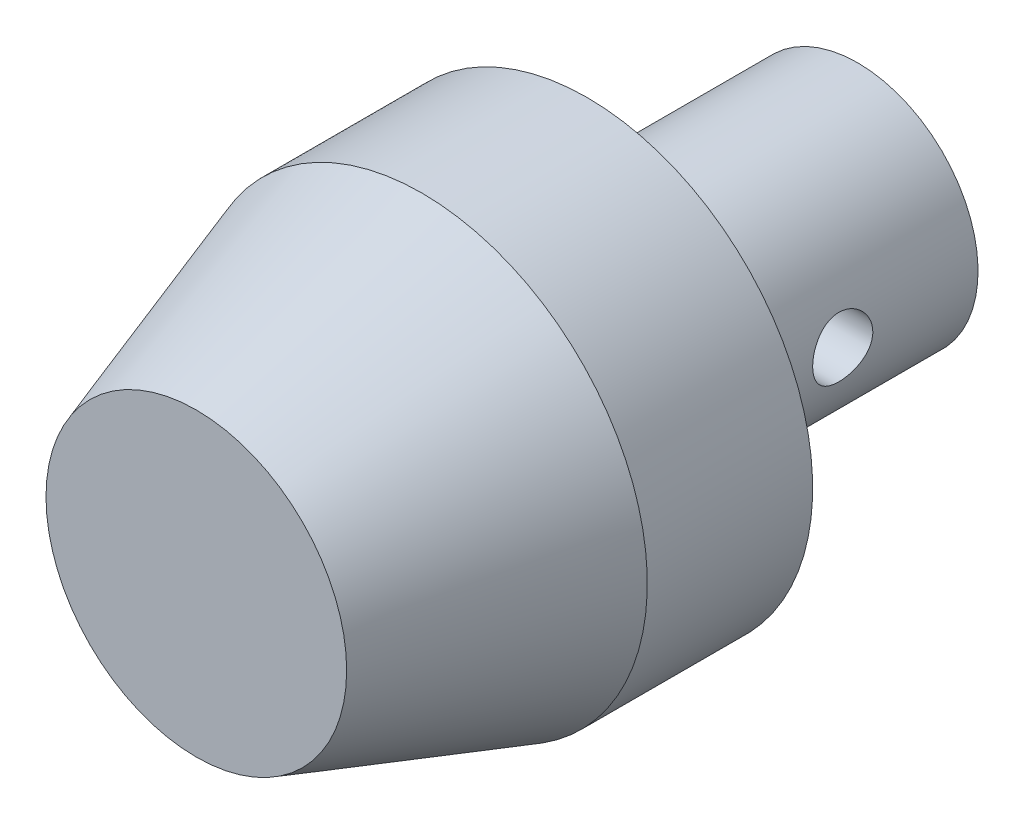
ISO-10303-21;
HEADER;
FILE_DESCRIPTION(('STEP AP214'),'2;1');
FILE_NAME('part.step','',(''),(''),'','','');
FILE_SCHEMA(('AUTOMOTIVE_DESIGN { 1 0 10303 214 1 1 1 1 }'));
ENDSEC;
DATA;
#1=APPLICATION_CONTEXT('core data for automotive mechanical design processes');
#2=APPLICATION_PROTOCOL_DEFINITION('international standard','automotive_design',2000,#1);
#3=PRODUCT_CONTEXT('',#1,'mechanical');
#4=PRODUCT('Part','Part','',(#3));
#5=PRODUCT_RELATED_PRODUCT_CATEGORY('part','',(#4));
#6=PRODUCT_DEFINITION_FORMATION('','',#4);
#7=PRODUCT_DEFINITION_CONTEXT('part definition',#1,'design');
#8=PRODUCT_DEFINITION('design','',#6,#7);
#9=PRODUCT_DEFINITION_SHAPE('','',#8);
#10=(LENGTH_UNIT() NAMED_UNIT(*) SI_UNIT(.MILLI.,.METRE.));
#11=(NAMED_UNIT(*) PLANE_ANGLE_UNIT() SI_UNIT($,.RADIAN.));
#12=(NAMED_UNIT(*) SI_UNIT($,.STERADIAN.) SOLID_ANGLE_UNIT());
#13=UNCERTAINTY_MEASURE_WITH_UNIT(LENGTH_MEASURE(1.E-05),#10,'distance_accuracy_value','');
#14=(GEOMETRIC_REPRESENTATION_CONTEXT(3) GLOBAL_UNCERTAINTY_ASSIGNED_CONTEXT((#13)) GLOBAL_UNIT_ASSIGNED_CONTEXT((#10,
#11,#12)) REPRESENTATION_CONTEXT('',''));
#15=CARTESIAN_POINT('',(0.,0.,0.));
#16=DIRECTION('',(0.,0.,1.));
#17=DIRECTION('',(1.,0.,0.));
#18=AXIS2_PLACEMENT_3D('',#15,#16,#17);
#19=CARTESIAN_POINT('',(0.,0.,0.));
#20=DIRECTION('',(0.,0.,1.));
#21=DIRECTION('',(0.,-1.,0.));
#22=AXIS2_PLACEMENT_3D('',#19,#20,#21);
#23=PLANE('',#22);
#24=CARTESIAN_POINT('',(0.,0.,0.));
#25=DIRECTION('',(0.,0.,-1.));
#26=DIRECTION('',(0.,1.,0.));
#27=AXIS2_PLACEMENT_3D('',#24,#25,#26);
#28=CIRCLE('',#27,10.);
#29=CARTESIAN_POINT('',(0.,10.,0.));
#30=VERTEX_POINT('',#29);
#31=EDGE_CURVE('E10',#30,#30,#28,.T.);
#32=ORIENTED_EDGE('',*,*,#31,.F.);
#33=EDGE_LOOP('',(#32));
#34=FACE_BOUND('',#33,.T.);
#35=ADVANCED_FACE('F28',(#34),#23,.T.);
#36=CARTESIAN_POINT('',(0.,0.,-15.));
#37=DIRECTION('',(0.,0.,-1.));
#38=DIRECTION('',(0.,1.,0.));
#39=AXIS2_PLACEMENT_3D('',#36,#37,#38);
#40=CONICAL_SURFACE('',#39,15.,0.321750554396642);
#41=ORIENTED_EDGE('',*,*,#31,.T.);
#42=EDGE_LOOP('',(#41));
#43=FACE_BOUND('',#42,.T.);
#44=CARTESIAN_POINT('',(0.,0.,-15.));
#45=DIRECTION('',(0.,0.,-1.));
#46=DIRECTION('',(0.,1.,0.));
#47=AXIS2_PLACEMENT_3D('',#44,#45,#46);
#48=CIRCLE('',#47,15.);
#49=CARTESIAN_POINT('',(0.,15.,-15.));
#50=VERTEX_POINT('',#49);
#51=EDGE_CURVE('E39',#50,#50,#48,.T.);
#52=ORIENTED_EDGE('',*,*,#51,.F.);
#53=EDGE_LOOP('',(#52));
#54=FACE_BOUND('',#53,.T.);
#55=ADVANCED_FACE('F70',(#43,#54),#40,.T.);
#56=CARTESIAN_POINT('',(0.,0.,-44.));
#57=DIRECTION('',(0.,0.,-1.));
#58=DIRECTION('',(0.,1.,0.));
#59=AXIS2_PLACEMENT_3D('',#56,#57,#58);
#60=CYLINDRICAL_SURFACE('',#59,15.);
#61=ORIENTED_EDGE('',*,*,#51,.T.);
#62=EDGE_LOOP('',(#61));
#63=FACE_BOUND('',#62,.T.);
#64=CARTESIAN_POINT('',(0.,0.,-26.));
#65=DIRECTION('',(0.,0.,-1.));
#66=DIRECTION('',(0.,1.,0.));
#67=AXIS2_PLACEMENT_3D('',#64,#65,#66);
#68=CIRCLE('',#67,15.);
#69=CARTESIAN_POINT('',(0.,15.,-26.));
#70=VERTEX_POINT('',#69);
#71=EDGE_CURVE('E44',#70,#70,#68,.T.);
#72=ORIENTED_EDGE('',*,*,#71,.F.);
#73=EDGE_LOOP('',(#72));
#74=FACE_BOUND('',#73,.T.);
#75=ADVANCED_FACE('F75',(#63,#74),#60,.T.);
#76=CARTESIAN_POINT('',(0.,15.,-26.));
#77=DIRECTION('',(0.,0.,-1.));
#78=DIRECTION('',(0.,1.,0.));
#79=AXIS2_PLACEMENT_3D('',#76,#77,#78);
#80=PLANE('',#79);
#81=ORIENTED_EDGE('',*,*,#71,.T.);
#82=EDGE_LOOP('',(#81));
#83=FACE_BOUND('',#82,.T.);
#84=CARTESIAN_POINT('',(0.,0.,-26.));
#85=DIRECTION('',(0.,0.,-1.));
#86=DIRECTION('',(0.,1.,0.));
#87=AXIS2_PLACEMENT_3D('',#84,#85,#86);
#88=CIRCLE('',#87,7.99999999999999);
#89=CARTESIAN_POINT('',(0.,7.99999999999999,-26.));
#90=VERTEX_POINT('',#89);
#91=EDGE_CURVE('E91',#90,#90,#88,.T.);
#92=ORIENTED_EDGE('',*,*,#91,.F.);
#93=EDGE_LOOP('',(#92));
#94=FACE_BOUND('',#93,.T.);
#95=ADVANCED_FACE('F66',(#83,#94),#80,.T.);
#96=CARTESIAN_POINT('',(0.,0.,-44.));
#97=DIRECTION('',(0.,0.,-1.));
#98=DIRECTION('',(0.,1.,0.));
#99=AXIS2_PLACEMENT_3D('',#96,#97,#98);
#100=CYLINDRICAL_SURFACE('',#99,7.99999999999999);
#101=CARTESIAN_POINT('',(-7.99999999999999,0.,-37.));
#102=CARTESIAN_POINT('',(-7.99999813157348,-0.110501451559642,-36.9999968990158));
#103=CARTESIAN_POINT('',(-7.99768770842434,-0.221037543774351,-36.990811265635));
#104=CARTESIAN_POINT('',(-7.98869485106525,-0.438941765027377,-36.954366464924));
#105=CARTESIAN_POINT('',(-7.982009938933,-0.54630806249432,-36.9270970539495));
#106=CARTESIAN_POINT('',(-7.96500835109375,-0.754694496243436,-36.8554143287172));
#107=CARTESIAN_POINT('',(-7.9546960378941,-0.855722084573335,-36.811021601713));
#108=CARTESIAN_POINT('',(-7.93153791743494,-1.04889617587257,-36.7064248132736));
#109=CARTESIAN_POINT('',(-7.91869202472207,-1.14104237913168,-36.646220218508));
#110=CARTESIAN_POINT('',(-7.8915655145559,-1.31573590306789,-36.5103989471278));
#111=CARTESIAN_POINT('',(-7.877262761975,-1.39807425341474,-36.4345179000546));
#112=CARTESIAN_POINT('',(-7.84898160157247,-1.54899856960443,-36.270063726788));
#113=CARTESIAN_POINT('',(-7.83500323053156,-1.61758298259892,-36.1814891694041));
#114=CARTESIAN_POINT('',(-7.80873034264223,-1.74003539039863,-35.992539697684));
#115=CARTESIAN_POINT('',(-7.79646392619747,-1.79366962123352,-35.8920090255884));
#116=CARTESIAN_POINT('',(-7.77532659757354,-1.88319587806766,-35.6830021177866));
#117=CARTESIAN_POINT('',(-7.76645514259224,-1.91909074058686,-35.5745271555573));
#118=CARTESIAN_POINT('',(-7.75333968928429,-1.97140644907302,-35.3550086690645));
#119=CARTESIAN_POINT('',(-7.7490065466268,-1.98820302444274,-35.244060138616));
#120=CARTESIAN_POINT('',(-7.74519149946121,-2.00301570008855,-35.0208419080009));
#121=CARTESIAN_POINT('',(-7.7457088057057,-2.00103485575748,-34.9085724257438));
#122=CARTESIAN_POINT('',(-7.75145607355755,-1.97864869951961,-34.6887789230062));
#123=CARTESIAN_POINT('',(-7.7565715067639,-1.95869112025418,-34.5812058380462));
#124=CARTESIAN_POINT('',(-7.77075612894757,-1.90163224920399,-34.3709852654519));
#125=CARTESIAN_POINT('',(-7.77982559958984,-1.86452973609253,-34.2683381292948));
#126=CARTESIAN_POINT('',(-7.80100151874211,-1.77385263724958,-34.0696826449972));
#127=CARTESIAN_POINT('',(-7.81313769959754,-1.72011555631056,-33.9737517709472));
#128=CARTESIAN_POINT('',(-7.83906281127987,-1.59780836801993,-33.7921083869909));
#129=CARTESIAN_POINT('',(-7.85285203112836,-1.52923566507845,-33.7063976692437));
#130=CARTESIAN_POINT('',(-7.88101174053187,-1.37688456624163,-33.5450618457408));
#131=CARTESIAN_POINT('',(-7.89538759304,-1.29272834422115,-33.4697940132515));
#132=CARTESIAN_POINT('',(-7.92274620771674,-1.11281589000493,-33.3343716767148));
#133=CARTESIAN_POINT('',(-7.93572892732542,-1.01705930361059,-33.2742176343152));
#134=CARTESIAN_POINT('',(-7.9589030945892,-0.816154518241856,-33.1705992183675));
#135=CARTESIAN_POINT('',(-7.96908480170302,-0.710975190944832,-33.1271928796608));
#136=CARTESIAN_POINT('',(-7.98543889321887,-0.494501344190511,-33.0587769257206));
#137=CARTESIAN_POINT('',(-7.99161204452373,-0.383207998867312,-33.0337637914425));
#138=CARTESIAN_POINT('',(-7.99913999028499,-0.160719960520035,-33.0033899125882));
#139=CARTESIAN_POINT('',(-8.00061404677704,-0.0495956266509456,-32.9975426318996));
#140=CARTESIAN_POINT('',(-7.998917397526,0.172043833068677,-33.0043320027406));
#141=CARTESIAN_POINT('',(-7.99574710989127,0.28255901285946,-33.0169669903988));
#142=CARTESIAN_POINT('',(-7.98519441503141,0.498152358368655,-33.0599612111885));
#143=CARTESIAN_POINT('',(-7.97787512247747,0.603286825291673,-33.0900550179693));
#144=CARTESIAN_POINT('',(-7.95984942178844,0.807009723270016,-33.1668094453712));
#145=CARTESIAN_POINT('',(-7.94914267159855,0.905597492043513,-33.2134717390842));
#146=CARTESIAN_POINT('',(-7.92524410568413,1.0953641792398,-33.3229815051663));
#147=CARTESIAN_POINT('',(-7.91201156489242,1.18638058911444,-33.3861014831957));
#148=CARTESIAN_POINT('',(-7.88459345583225,1.35670215152433,-33.5263865450626));
#149=CARTESIAN_POINT('',(-7.87040772335605,1.43600527863068,-33.6035540528225));
#150=CARTESIAN_POINT('',(-7.84225275947694,1.58265409076364,-33.7720026144593));
#151=CARTESIAN_POINT('',(-7.82829738916374,1.64965849016271,-33.8635836040032));
#152=CARTESIAN_POINT('',(-7.8025717116965,1.7673476786836,-34.0569768459543));
#153=CARTESIAN_POINT('',(-7.79080130756034,1.81803319221058,-34.1587886439463));
#154=CARTESIAN_POINT('',(-7.77090792979552,1.90126856081239,-34.3692076298841));
#155=CARTESIAN_POINT('',(-7.76276340389206,1.93392586220542,-34.4777701711253));
#156=CARTESIAN_POINT('',(-7.75102325453577,1.98046087993837,-34.6990795171855));
#157=CARTESIAN_POINT('',(-7.7474266362658,1.99434270330488,-34.8118254013766));
#158=CARTESIAN_POINT('',(-7.74526534938608,2.00271812044533,-35.0348280318069));
#159=CARTESIAN_POINT('',(-7.7465591030435,1.99775719704016,-35.145063246833));
#160=CARTESIAN_POINT('',(-7.75370545343789,1.96983637108383,-35.3630718515573));
#161=CARTESIAN_POINT('',(-7.75955795855808,1.94687683024903,-35.4708452906849));
#162=CARTESIAN_POINT('',(-7.77508347576962,1.88390842592373,-35.6802779454205));
#163=CARTESIAN_POINT('',(-7.78473353648411,1.84400187290717,-35.7819697403203));
#164=CARTESIAN_POINT('',(-7.80677007633104,1.7483532181401,-35.9772871769516));
#165=CARTESIAN_POINT('',(-7.81915693494363,1.69260892004559,-36.0709116975826));
#166=CARTESIAN_POINT('',(-7.84567512351348,1.56515699818285,-36.2500728386694));
#167=CARTESIAN_POINT('',(-7.85984353109008,1.49307088388301,-36.3353347645653));
#168=CARTESIAN_POINT('',(-7.88810702995046,1.33571916158631,-36.4927293930605));
#169=CARTESIAN_POINT('',(-7.90220210302745,1.2504504283482,-36.564858973484));
#170=CARTESIAN_POINT('',(-7.92903540863549,1.06729011560346,-36.6952150780861));
#171=CARTESIAN_POINT('',(-7.94174444487823,0.969197896421853,-36.7531661515621));
#172=CARTESIAN_POINT('',(-7.9640656663349,0.764354746013971,-36.8516632839207));
#173=CARTESIAN_POINT('',(-7.97368006933041,0.65761008458232,-36.892221814198));
#174=CARTESIAN_POINT('',(-7.98730746087387,0.459213670991295,-36.9487624404395));
#175=CARTESIAN_POINT('',(-7.9920344673692,0.368506894544091,-36.9679349907379));
#176=CARTESIAN_POINT('',(-7.99838140309264,0.185208095381711,-36.9935545914959));
#177=CARTESIAN_POINT('',(-8.00000156601192,0.0926162149901547,-37.0000025990737));
#178=CARTESIAN_POINT('',(-7.99999999999999,0.,-37.));
#179=B_SPLINE_CURVE_WITH_KNOTS('',3,(#101,#102,#103,#104,#105,#106,#107,#108,#109,#110,#111,
#112,#113,#114,#115,#116,#117,#118,#119,#120,#121,#122,#123,#124,#125,#126,#127,#128,#129,#130,
#131,#132,#133,#134,#135,#136,#137,#138,#139,#140,#141,#142,#143,#144,#145,#146,#147,#148,#149,
#150,#151,#152,#153,#154,#155,#156,#157,#158,#159,#160,#161,#162,#163,#164,#165,#166,#167,#168,
#169,#170,#171,#172,#173,#174,#175,#176,#177,#178),.UNSPECIFIED.,.T.,.F.,(4,2,2,2,2,2,2,2,2,2,2,
2,2,2,2,2,2,2,2,2,2,2,2,2,2,2,2,2,2,2,2,2,2,2,2,2,2,2,4),(0.,0.33116494996252,0.662517650351866,
0.993473203048139,1.32443992022577,1.66152580582852,1.99864972773415,2.34078196727742,
2.68285948225824,3.01808393468094,3.35325384154691,3.68029996013786,4.00736937959146,
4.337740371696,4.66816921119312,5.00802001296454,5.34788119415425,5.6889097201658,
6.02987298255952,6.36211078603464,6.69431868154752,7.02160366023145,7.34892169767483,
7.68204783424898,8.01523150681787,8.35659345610397,8.69794025003773,9.03723006156477,
9.37644564340972,9.70591707202577,10.0353818794581,10.3628853408369,10.6904342418696,
11.0265276855098,11.3627009303165,11.7049624733721,12.046978184329,12.3245632392729,
12.6021274139515),.UNSPECIFIED.);
#180=CARTESIAN_POINT('',(-7.99999999999999,0.,-37.));
#181=VERTEX_POINT('',#180);
#182=EDGE_CURVE('E31',#181,#181,#179,.T.);
#183=ORIENTED_EDGE('',*,*,#182,.F.);
#184=EDGE_LOOP('',(#183));
#185=FACE_BOUND('',#184,.T.);
#186=CARTESIAN_POINT('',(7.99999999999999,0.,-37.));
#187=CARTESIAN_POINT('',(7.99999813157349,0.110501451559642,-36.9999968990158));
#188=CARTESIAN_POINT('',(7.99768770842434,0.221037543774351,-36.990811265635));
#189=CARTESIAN_POINT('',(7.98869485106525,0.438941765027377,-36.954366464924));
#190=CARTESIAN_POINT('',(7.982009938933,0.54630806249432,-36.9270970539495));
#191=CARTESIAN_POINT('',(7.96500835109375,0.754694496243438,-36.8554143287172));
#192=CARTESIAN_POINT('',(7.9546960378941,0.85572208457334,-36.811021601713));
#193=CARTESIAN_POINT('',(7.93153791743494,1.04889617587257,-36.7064248132736));
#194=CARTESIAN_POINT('',(7.91869202472208,1.14104237913169,-36.646220218508));
#195=CARTESIAN_POINT('',(7.8915655145559,1.31573590306789,-36.5103989471278));
#196=CARTESIAN_POINT('',(7.877262761975,1.39807425341474,-36.4345179000546));
#197=CARTESIAN_POINT('',(7.84898160157247,1.54899856960443,-36.270063726788));
#198=CARTESIAN_POINT('',(7.83500323053156,1.61758298259892,-36.1814891694041));
#199=CARTESIAN_POINT('',(7.80873034264224,1.74003539039863,-35.992539697684));
#200=CARTESIAN_POINT('',(7.79646392619747,1.79366962123352,-35.8920090255884));
#201=CARTESIAN_POINT('',(7.77532659757354,1.88319587806766,-35.6830021177866));
#202=CARTESIAN_POINT('',(7.76645514259224,1.91909074058686,-35.5745271555573));
#203=CARTESIAN_POINT('',(7.75333968928429,1.97140644907302,-35.3550086690645));
#204=CARTESIAN_POINT('',(7.7490065466268,1.98820302444274,-35.244060138616));
#205=CARTESIAN_POINT('',(7.74519149946121,2.00301570008855,-35.0208419080009));
#206=CARTESIAN_POINT('',(7.7457088057057,2.00103485575748,-34.9085724257438));
#207=CARTESIAN_POINT('',(7.75145607355755,1.97864869951961,-34.6887789230062));
#208=CARTESIAN_POINT('',(7.7565715067639,1.95869112025418,-34.5812058380462));
#209=CARTESIAN_POINT('',(7.77075612894757,1.90163224920399,-34.3709852654519));
#210=CARTESIAN_POINT('',(7.77982559958984,1.86452973609253,-34.2683381292948));
#211=CARTESIAN_POINT('',(7.80100151874211,1.77385263724958,-34.0696826449972));
#212=CARTESIAN_POINT('',(7.81313769959754,1.72011555631056,-33.9737517709472));
#213=CARTESIAN_POINT('',(7.83906281127987,1.59780836801993,-33.7921083869909));
#214=CARTESIAN_POINT('',(7.85285203112836,1.52923566507845,-33.7063976692437));
#215=CARTESIAN_POINT('',(7.88101174053187,1.37688456624163,-33.5450618457408));
#216=CARTESIAN_POINT('',(7.89538759304,1.29272834422115,-33.4697940132515));
#217=CARTESIAN_POINT('',(7.92274620771674,1.11281589000493,-33.3343716767148));
#218=CARTESIAN_POINT('',(7.93572892732542,1.01705930361059,-33.2742176343152));
#219=CARTESIAN_POINT('',(7.9589030945892,0.816154518241855,-33.1705992183675));
#220=CARTESIAN_POINT('',(7.96908480170302,0.71097519094483,-33.1271928796608));
#221=CARTESIAN_POINT('',(7.98543889321887,0.494501344190509,-33.0587769257206));
#222=CARTESIAN_POINT('',(7.99161204452373,0.383207998867311,-33.0337637914425));
#223=CARTESIAN_POINT('',(7.99913999028499,0.160719960520034,-33.0033899125882));
#224=CARTESIAN_POINT('',(8.00061404677704,0.0495956266509452,-32.9975426318996));
#225=CARTESIAN_POINT('',(7.998917397526,-0.172043833068678,-33.0043320027406));
#226=CARTESIAN_POINT('',(7.99574710989127,-0.28255901285946,-33.0169669903988));
#227=CARTESIAN_POINT('',(7.98519441503141,-0.498152358368656,-33.0599612111885));
#228=CARTESIAN_POINT('',(7.97787512247747,-0.603286825291673,-33.0900550179693));
#229=CARTESIAN_POINT('',(7.95984942178844,-0.807009723270016,-33.1668094453712));
#230=CARTESIAN_POINT('',(7.94914267159855,-0.905597492043513,-33.2134717390842));
#231=CARTESIAN_POINT('',(7.92524410568413,-1.0953641792398,-33.3229815051663));
#232=CARTESIAN_POINT('',(7.91201156489242,-1.18638058911444,-33.3861014831957));
#233=CARTESIAN_POINT('',(7.88459345583225,-1.35670215152433,-33.5263865450626));
#234=CARTESIAN_POINT('',(7.87040772335605,-1.43600527863068,-33.6035540528225));
#235=CARTESIAN_POINT('',(7.84225275947694,-1.58265409076364,-33.7720026144593));
#236=CARTESIAN_POINT('',(7.82829738916374,-1.64965849016271,-33.8635836040032));
#237=CARTESIAN_POINT('',(7.8025717116965,-1.7673476786836,-34.0569768459543));
#238=CARTESIAN_POINT('',(7.79080130756033,-1.81803319221058,-34.1587886439463));
#239=CARTESIAN_POINT('',(7.77090792979552,-1.90126856081239,-34.3692076298841));
#240=CARTESIAN_POINT('',(7.76276340389206,-1.93392586220542,-34.4777701711253));
#241=CARTESIAN_POINT('',(7.75102325453577,-1.98046087993837,-34.6990795171855));
#242=CARTESIAN_POINT('',(7.7474266362658,-1.99434270330488,-34.8118254013766));
#243=CARTESIAN_POINT('',(7.74526534938608,-2.00271812044533,-35.0348280318069));
#244=CARTESIAN_POINT('',(7.7465591030435,-1.99775719704016,-35.145063246833));
#245=CARTESIAN_POINT('',(7.75370545343789,-1.96983637108382,-35.3630718515573));
#246=CARTESIAN_POINT('',(7.75955795855808,-1.94687683024903,-35.4708452906849));
#247=CARTESIAN_POINT('',(7.77508347576962,-1.88390842592373,-35.6802779454205));
#248=CARTESIAN_POINT('',(7.78473353648411,-1.84400187290717,-35.7819697403203));
#249=CARTESIAN_POINT('',(7.80677007633104,-1.7483532181401,-35.9772871769516));
#250=CARTESIAN_POINT('',(7.81915693494363,-1.69260892004559,-36.0709116975826));
#251=CARTESIAN_POINT('',(7.84567512351348,-1.56515699818285,-36.2500728386694));
#252=CARTESIAN_POINT('',(7.85984353109008,-1.49307088388301,-36.3353347645653));
#253=CARTESIAN_POINT('',(7.88810702995046,-1.33571916158631,-36.4927293930605));
#254=CARTESIAN_POINT('',(7.90220210302745,-1.2504504283482,-36.564858973484));
#255=CARTESIAN_POINT('',(7.92903540863549,-1.06729011560346,-36.6952150780861));
#256=CARTESIAN_POINT('',(7.94174444487823,-0.969197896421852,-36.7531661515621));
#257=CARTESIAN_POINT('',(7.9640656663349,-0.764354746013971,-36.8516632839207));
#258=CARTESIAN_POINT('',(7.97368006933041,-0.65761008458232,-36.892221814198));
#259=CARTESIAN_POINT('',(7.98730746087387,-0.459213670991295,-36.9487624404395));
#260=CARTESIAN_POINT('',(7.99203446736919,-0.368506894544091,-36.9679349907379));
#261=CARTESIAN_POINT('',(7.99838140309263,-0.185208095381711,-36.9935545914959));
#262=CARTESIAN_POINT('',(8.00000156601191,-0.0926162149901548,-37.0000025990737));
#263=CARTESIAN_POINT('',(7.99999999999999,0.,-37.));
#264=B_SPLINE_CURVE_WITH_KNOTS('',3,(#186,#187,#188,#189,#190,#191,#192,#193,#194,#195,#196,
#197,#198,#199,#200,#201,#202,#203,#204,#205,#206,#207,#208,#209,#210,#211,#212,#213,#214,#215,
#216,#217,#218,#219,#220,#221,#222,#223,#224,#225,#226,#227,#228,#229,#230,#231,#232,#233,#234,
#235,#236,#237,#238,#239,#240,#241,#242,#243,#244,#245,#246,#247,#248,#249,#250,#251,#252,#253,
#254,#255,#256,#257,#258,#259,#260,#261,#262,#263),.UNSPECIFIED.,.T.,.F.,(4,2,2,2,2,2,2,2,2,2,2,
2,2,2,2,2,2,2,2,2,2,2,2,2,2,2,2,2,2,2,2,2,2,2,2,2,2,2,4),(0.,0.33116494996252,0.662517650351866,
0.993473203048144,1.32443992022577,1.66152580582852,1.99864972773416,2.34078196727742,
2.68285948225825,3.01808393468094,3.35325384154691,3.68029996013786,4.00736937959146,
4.337740371696,4.66816921119312,5.00802001296454,5.34788119415425,5.68890972016581,
6.02987298255952,6.36211078603464,6.69431868154752,7.02160366023145,7.34892169767483,
7.68204783424898,8.01523150681787,8.35659345610397,8.69794025003773,9.03723006156477,
9.37644564340972,9.7059170720258,10.0353818794581,10.3628853408369,10.6904342418696,
11.0265276855098,11.3627009303165,11.7049624733721,12.046978184329,12.3245632392729,
12.6021274139515),.UNSPECIFIED.);
#265=CARTESIAN_POINT('',(7.99999999999999,0.,-37.));
#266=VERTEX_POINT('',#265);
#267=EDGE_CURVE('E47',#266,#266,#264,.T.);
#268=ORIENTED_EDGE('',*,*,#267,.F.);
#269=EDGE_LOOP('',(#268));
#270=FACE_BOUND('',#269,.T.);
#271=ORIENTED_EDGE('',*,*,#91,.T.);
#272=EDGE_LOOP('',(#271));
#273=FACE_BOUND('',#272,.T.);
#274=CARTESIAN_POINT('',(0.,0.,-44.));
#275=DIRECTION('',(0.,0.,-1.));
#276=DIRECTION('',(0.,1.,0.));
#277=AXIS2_PLACEMENT_3D('',#274,#275,#276);
#278=CIRCLE('',#277,7.99999999999999);
#279=CARTESIAN_POINT('',(0.,7.99999999999999,-44.));
#280=VERTEX_POINT('',#279);
#281=EDGE_CURVE('E93',#280,#280,#278,.T.);
#282=ORIENTED_EDGE('',*,*,#281,.F.);
#283=EDGE_LOOP('',(#282));
#284=FACE_BOUND('',#283,.T.);
#285=ADVANCED_FACE('F51',(#185,#270,#273,#284),#100,.T.);
#286=CARTESIAN_POINT('',(0.,7.99999999999999,-44.));
#287=DIRECTION('',(0.,0.,-1.));
#288=DIRECTION('',(0.,1.,0.));
#289=AXIS2_PLACEMENT_3D('',#286,#287,#288);
#290=PLANE('',#289);
#291=ORIENTED_EDGE('',*,*,#281,.T.);
#292=EDGE_LOOP('',(#291));
#293=FACE_BOUND('',#292,.T.);
#294=ADVANCED_FACE('F58',(#293),#290,.T.);
#295=CARTESIAN_POINT('',(-10.,0.,-35.));
#296=DIRECTION('',(1.,0.,0.));
#297=DIRECTION('',(0.,0.,-1.));
#298=AXIS2_PLACEMENT_3D('',#295,#296,#297);
#299=CYLINDRICAL_SURFACE('',#298,2.);
#300=ORIENTED_EDGE('',*,*,#182,.T.);
#301=EDGE_LOOP('',(#300));
#302=FACE_BOUND('',#301,.T.);
#303=ORIENTED_EDGE('',*,*,#267,.T.);
#304=EDGE_LOOP('',(#303));
#305=FACE_BOUND('',#304,.T.);
#306=ADVANCED_FACE('F55',(#302,#305),#299,.F.);
#307=CLOSED_SHELL('',(#35,#55,#75,#95,#285,#294,#306));
#308=MANIFOLD_SOLID_BREP('B2',#307);
#309=ADVANCED_BREP_SHAPE_REPRESENTATION('',(#18,#308),#14);
#310=SHAPE_DEFINITION_REPRESENTATION(#9,#309);
ENDSEC;
END-ISO-10303-21;
